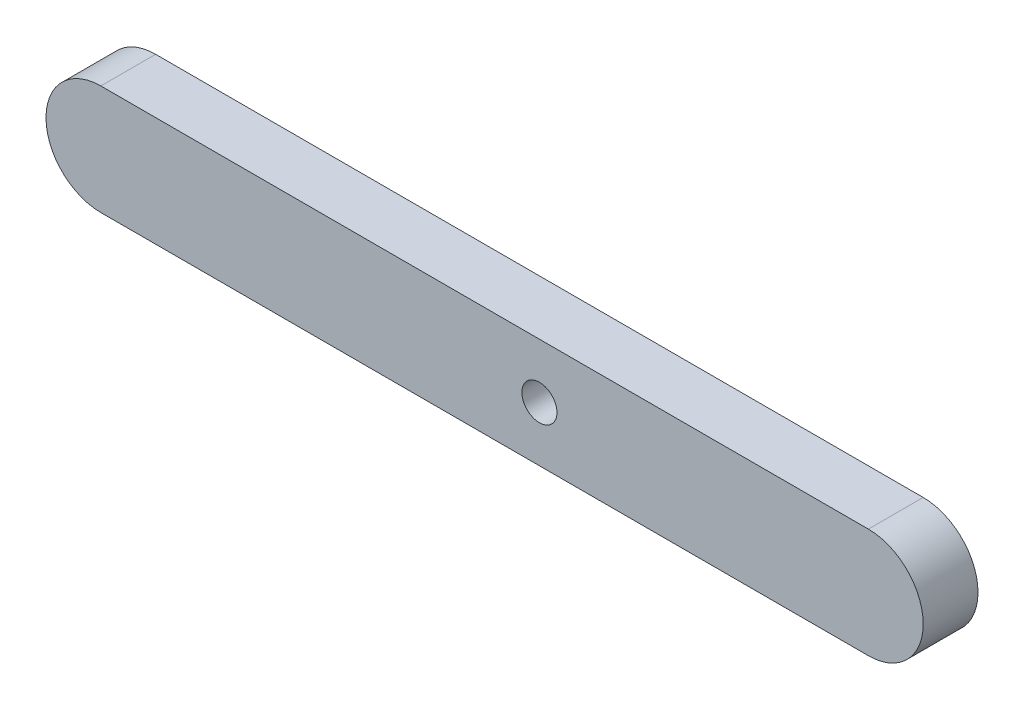
ISO-10303-21;
HEADER;
FILE_DESCRIPTION(('STEP AP214'),'2;1');
FILE_NAME('part.step','',(''),(''),'','','');
FILE_SCHEMA(('AUTOMOTIVE_DESIGN { 1 0 10303 214 1 1 1 1 }'));
ENDSEC;
DATA;
#1=APPLICATION_CONTEXT('core data for automotive mechanical design processes');
#2=APPLICATION_PROTOCOL_DEFINITION('international standard','automotive_design',2000,#1);
#3=PRODUCT_CONTEXT('',#1,'mechanical');
#4=PRODUCT('Part','Part','',(#3));
#5=PRODUCT_RELATED_PRODUCT_CATEGORY('part','',(#4));
#6=PRODUCT_DEFINITION_FORMATION('','',#4);
#7=PRODUCT_DEFINITION_CONTEXT('part definition',#1,'design');
#8=PRODUCT_DEFINITION('design','',#6,#7);
#9=PRODUCT_DEFINITION_SHAPE('','',#8);
#10=(LENGTH_UNIT() NAMED_UNIT(*) SI_UNIT(.MILLI.,.METRE.));
#11=(NAMED_UNIT(*) PLANE_ANGLE_UNIT() SI_UNIT($,.RADIAN.));
#12=(NAMED_UNIT(*) SI_UNIT($,.STERADIAN.) SOLID_ANGLE_UNIT());
#13=UNCERTAINTY_MEASURE_WITH_UNIT(LENGTH_MEASURE(1.E-05),#10,'distance_accuracy_value','');
#14=(GEOMETRIC_REPRESENTATION_CONTEXT(3) GLOBAL_UNCERTAINTY_ASSIGNED_CONTEXT((#13)) GLOBAL_UNIT_ASSIGNED_CONTEXT((#10,
#11,#12)) REPRESENTATION_CONTEXT('',''));
#15=CARTESIAN_POINT('',(0.,0.,0.));
#16=DIRECTION('',(0.,0.,1.));
#17=DIRECTION('',(1.,0.,0.));
#18=AXIS2_PLACEMENT_3D('',#15,#16,#17);
#19=CARTESIAN_POINT('',(0.,0.,5.));
#20=DIRECTION('',(0.,0.,1.));
#21=DIRECTION('',(1.,0.,0.));
#22=AXIS2_PLACEMENT_3D('',#19,#20,#21);
#23=PLANE('',#22);
#24=CARTESIAN_POINT('',(0.,0.,5.));
#25=DIRECTION('',(0.,0.,1.));
#26=DIRECTION('',(1.,0.,0.));
#27=AXIS2_PLACEMENT_3D('',#24,#25,#26);
#28=CIRCLE('',#27,5.);
#29=CARTESIAN_POINT('',(0.,5.,5.));
#30=VERTEX_POINT('',#29);
#31=CARTESIAN_POINT('',(0.,-5.,5.));
#32=VERTEX_POINT('',#31);
#33=EDGE_CURVE('E92',#30,#32,#28,.T.);
#34=ORIENTED_EDGE('',*,*,#33,.T.);
#35=DIRECTION('',(1.,0.,0.));
#36=VECTOR('',#35,1.);
#37=CARTESIAN_POINT('',(0.,-5.,5.));
#38=LINE('',#37,#36);
#39=CARTESIAN_POINT('',(70.,-5.,5.));
#40=VERTEX_POINT('',#39);
#41=EDGE_CURVE('E87',#32,#40,#38,.T.);
#42=ORIENTED_EDGE('',*,*,#41,.T.);
#43=CARTESIAN_POINT('',(70.,0.,5.));
#44=DIRECTION('',(0.,0.,1.));
#45=DIRECTION('',(1.,0.,0.));
#46=AXIS2_PLACEMENT_3D('',#43,#44,#45);
#47=CIRCLE('',#46,5.);
#48=CARTESIAN_POINT('',(70.,5.,5.));
#49=VERTEX_POINT('',#48);
#50=EDGE_CURVE('E90',#40,#49,#47,.T.);
#51=ORIENTED_EDGE('',*,*,#50,.T.);
#52=DIRECTION('',(-1.,0.,0.));
#53=VECTOR('',#52,1.);
#54=CARTESIAN_POINT('',(0.,5.,5.));
#55=LINE('',#54,#53);
#56=EDGE_CURVE('E57',#49,#30,#55,.T.);
#57=ORIENTED_EDGE('',*,*,#56,.T.);
#58=EDGE_LOOP('',(#34,#42,#51,#57));
#59=FACE_BOUND('',#58,.T.);
#60=CARTESIAN_POINT('',(40.,0.,5.));
#61=DIRECTION('',(0.,0.,1.));
#62=DIRECTION('',(1.,0.,0.));
#63=AXIS2_PLACEMENT_3D('',#60,#61,#62);
#64=CIRCLE('',#63,1.6);
#65=CARTESIAN_POINT('',(41.6,0.,5.));
#66=VERTEX_POINT('',#65);
#67=EDGE_CURVE('E112',#66,#66,#64,.T.);
#68=ORIENTED_EDGE('',*,*,#67,.F.);
#69=EDGE_LOOP('',(#68));
#70=FACE_BOUND('',#69,.T.);
#71=ADVANCED_FACE('F39',(#59,#70),#23,.T.);
#72=CARTESIAN_POINT('',(0.,0.,0.));
#73=DIRECTION('',(0.,0.,1.));
#74=DIRECTION('',(1.,0.,0.));
#75=AXIS2_PLACEMENT_3D('',#72,#73,#74);
#76=PLANE('',#75);
#77=CARTESIAN_POINT('',(0.,0.,0.));
#78=DIRECTION('',(0.,0.,1.));
#79=DIRECTION('',(1.,0.,0.));
#80=AXIS2_PLACEMENT_3D('',#77,#78,#79);
#81=CIRCLE('',#80,5.);
#82=CARTESIAN_POINT('',(0.,5.,0.));
#83=VERTEX_POINT('',#82);
#84=CARTESIAN_POINT('',(0.,-5.,0.));
#85=VERTEX_POINT('',#84);
#86=EDGE_CURVE('E108',#83,#85,#81,.T.);
#87=ORIENTED_EDGE('',*,*,#86,.F.);
#88=DIRECTION('',(-1.,0.,0.));
#89=VECTOR('',#88,1.);
#90=CARTESIAN_POINT('',(0.,5.,0.));
#91=LINE('',#90,#89);
#92=CARTESIAN_POINT('',(70.,5.,0.));
#93=VERTEX_POINT('',#92);
#94=EDGE_CURVE('E80',#93,#83,#91,.T.);
#95=ORIENTED_EDGE('',*,*,#94,.F.);
#96=CARTESIAN_POINT('',(70.,0.,0.));
#97=DIRECTION('',(0.,0.,1.));
#98=DIRECTION('',(1.,0.,0.));
#99=AXIS2_PLACEMENT_3D('',#96,#97,#98);
#100=CIRCLE('',#99,5.);
#101=CARTESIAN_POINT('',(70.,-5.,0.));
#102=VERTEX_POINT('',#101);
#103=EDGE_CURVE('E74',#102,#93,#100,.T.);
#104=ORIENTED_EDGE('',*,*,#103,.F.);
#105=DIRECTION('',(1.,0.,0.));
#106=VECTOR('',#105,1.);
#107=CARTESIAN_POINT('',(0.,-5.,0.));
#108=LINE('',#107,#106);
#109=EDGE_CURVE('E97',#85,#102,#108,.T.);
#110=ORIENTED_EDGE('',*,*,#109,.F.);
#111=EDGE_LOOP('',(#87,#95,#104,#110));
#112=FACE_BOUND('',#111,.T.);
#113=CARTESIAN_POINT('',(40.,0.,0.));
#114=DIRECTION('',(0.,0.,1.));
#115=DIRECTION('',(1.,0.,0.));
#116=AXIS2_PLACEMENT_3D('',#113,#114,#115);
#117=CIRCLE('',#116,1.6);
#118=CARTESIAN_POINT('',(41.6,0.,0.));
#119=VERTEX_POINT('',#118);
#120=EDGE_CURVE('E130',#119,#119,#117,.T.);
#121=ORIENTED_EDGE('',*,*,#120,.T.);
#122=EDGE_LOOP('',(#121));
#123=FACE_BOUND('',#122,.T.);
#124=ADVANCED_FACE('F125',(#112,#123),#76,.F.);
#125=CARTESIAN_POINT('',(0.,0.,5.));
#126=DIRECTION('',(0.,0.,-1.));
#127=DIRECTION('',(-1.,0.,0.));
#128=AXIS2_PLACEMENT_3D('',#125,#126,#127);
#129=CYLINDRICAL_SURFACE('',#128,5.);
#130=ORIENTED_EDGE('',*,*,#86,.T.);
#131=DIRECTION('',(0.,0.,-1.));
#132=VECTOR('',#131,1.);
#133=CARTESIAN_POINT('',(0.,-5.,5.));
#134=LINE('',#133,#132);
#135=EDGE_CURVE('E11',#32,#85,#134,.T.);
#136=ORIENTED_EDGE('',*,*,#135,.F.);
#137=ORIENTED_EDGE('',*,*,#33,.F.);
#138=DIRECTION('',(0.,0.,-1.));
#139=VECTOR('',#138,1.);
#140=CARTESIAN_POINT('',(0.,5.,5.));
#141=LINE('',#140,#139);
#142=EDGE_CURVE('E104',#30,#83,#141,.T.);
#143=ORIENTED_EDGE('',*,*,#142,.T.);
#144=EDGE_LOOP('',(#130,#136,#137,#143));
#145=FACE_BOUND('',#144,.T.);
#146=ADVANCED_FACE('F41',(#145),#129,.T.);
#147=CARTESIAN_POINT('',(0.,-5.,5.));
#148=DIRECTION('',(0.,1.,0.));
#149=DIRECTION('',(0.,0.,1.));
#150=AXIS2_PLACEMENT_3D('',#147,#148,#149);
#151=PLANE('',#150);
#152=ORIENTED_EDGE('',*,*,#109,.T.);
#153=DIRECTION('',(0.,0.,-1.));
#154=VECTOR('',#153,1.);
#155=CARTESIAN_POINT('',(70.,-5.,5.));
#156=LINE('',#155,#154);
#157=EDGE_CURVE('E49',#40,#102,#156,.T.);
#158=ORIENTED_EDGE('',*,*,#157,.F.);
#159=ORIENTED_EDGE('',*,*,#41,.F.);
#160=ORIENTED_EDGE('',*,*,#135,.T.);
#161=EDGE_LOOP('',(#152,#158,#159,#160));
#162=FACE_BOUND('',#161,.T.);
#163=ADVANCED_FACE('F96',(#162),#151,.F.);
#164=CARTESIAN_POINT('',(70.,0.,5.));
#165=DIRECTION('',(0.,0.,-1.));
#166=DIRECTION('',(-1.,0.,0.));
#167=AXIS2_PLACEMENT_3D('',#164,#165,#166);
#168=CYLINDRICAL_SURFACE('',#167,5.);
#169=ORIENTED_EDGE('',*,*,#103,.T.);
#170=DIRECTION('',(0.,0.,-1.));
#171=VECTOR('',#170,1.);
#172=CARTESIAN_POINT('',(70.,5.,5.));
#173=LINE('',#172,#171);
#174=EDGE_CURVE('E99',#49,#93,#173,.T.);
#175=ORIENTED_EDGE('',*,*,#174,.F.);
#176=ORIENTED_EDGE('',*,*,#50,.F.);
#177=ORIENTED_EDGE('',*,*,#157,.T.);
#178=EDGE_LOOP('',(#169,#175,#176,#177));
#179=FACE_BOUND('',#178,.T.);
#180=ADVANCED_FACE('F100',(#179),#168,.T.);
#181=CARTESIAN_POINT('',(0.,5.,5.));
#182=DIRECTION('',(0.,-1.,0.));
#183=DIRECTION('',(0.,0.,-1.));
#184=AXIS2_PLACEMENT_3D('',#181,#182,#183);
#185=PLANE('',#184);
#186=ORIENTED_EDGE('',*,*,#94,.T.);
#187=ORIENTED_EDGE('',*,*,#142,.F.);
#188=ORIENTED_EDGE('',*,*,#56,.F.);
#189=ORIENTED_EDGE('',*,*,#174,.T.);
#190=EDGE_LOOP('',(#186,#187,#188,#189));
#191=FACE_BOUND('',#190,.T.);
#192=ADVANCED_FACE('F122',(#191),#185,.F.);
#193=CARTESIAN_POINT('',(40.,0.,5.));
#194=DIRECTION('',(0.,0.,-1.));
#195=DIRECTION('',(-1.,0.,0.));
#196=AXIS2_PLACEMENT_3D('',#193,#194,#195);
#197=CYLINDRICAL_SURFACE('',#196,1.6);
#198=ORIENTED_EDGE('',*,*,#67,.T.);
#199=EDGE_LOOP('',(#198));
#200=FACE_BOUND('',#199,.T.);
#201=ORIENTED_EDGE('',*,*,#120,.F.);
#202=EDGE_LOOP('',(#201));
#203=FACE_BOUND('',#202,.T.);
#204=ADVANCED_FACE('F138',(#200,#203),#197,.F.);
#205=CLOSED_SHELL('',(#71,#124,#146,#163,#180,#192,#204));
#206=MANIFOLD_SOLID_BREP('B2',#205);
#207=ADVANCED_BREP_SHAPE_REPRESENTATION('',(#18,#206),#14);
#208=SHAPE_DEFINITION_REPRESENTATION(#9,#207);
ENDSEC;
END-ISO-10303-21;
